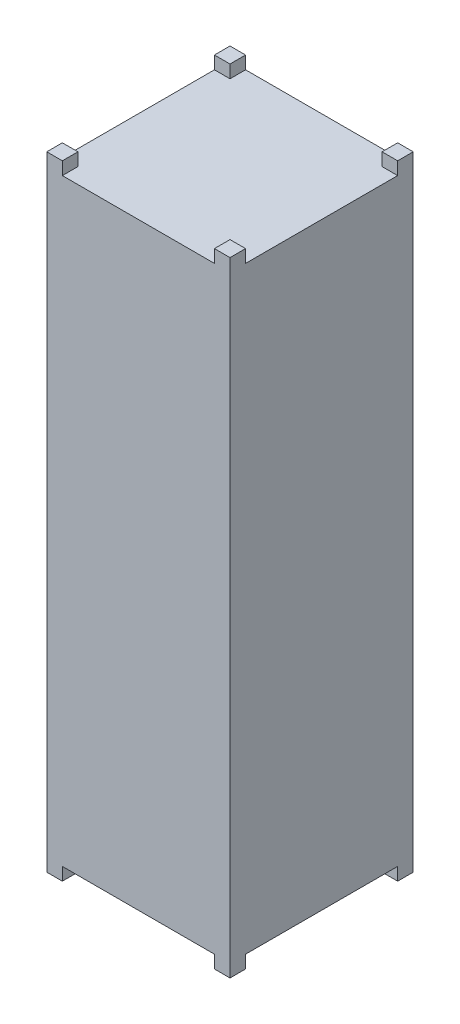
ISO-10303-21;
HEADER;
FILE_DESCRIPTION(('STEP AP214'),'2;1');
FILE_NAME('part.step','',(''),(''),'','','');
FILE_SCHEMA(('AUTOMOTIVE_DESIGN { 1 0 10303 214 1 1 1 1 }'));
ENDSEC;
DATA;
#1=APPLICATION_CONTEXT('core data for automotive mechanical design processes');
#2=APPLICATION_PROTOCOL_DEFINITION('international standard','automotive_design',2000,#1);
#3=PRODUCT_CONTEXT('',#1,'mechanical');
#4=PRODUCT('Part','Part','',(#3));
#5=PRODUCT_RELATED_PRODUCT_CATEGORY('part','',(#4));
#6=PRODUCT_DEFINITION_FORMATION('','',#4);
#7=PRODUCT_DEFINITION_CONTEXT('part definition',#1,'design');
#8=PRODUCT_DEFINITION('design','',#6,#7);
#9=PRODUCT_DEFINITION_SHAPE('','',#8);
#10=(LENGTH_UNIT() NAMED_UNIT(*) SI_UNIT(.MILLI.,.METRE.));
#11=(NAMED_UNIT(*) PLANE_ANGLE_UNIT() SI_UNIT($,.RADIAN.));
#12=(NAMED_UNIT(*) SI_UNIT($,.STERADIAN.) SOLID_ANGLE_UNIT());
#13=UNCERTAINTY_MEASURE_WITH_UNIT(LENGTH_MEASURE(1.E-05),#10,'distance_accuracy_value','');
#14=(GEOMETRIC_REPRESENTATION_CONTEXT(3) GLOBAL_UNCERTAINTY_ASSIGNED_CONTEXT((#13)) GLOBAL_UNIT_ASSIGNED_CONTEXT((#10,
#11,#12)) REPRESENTATION_CONTEXT('',''));
#15=CARTESIAN_POINT('',(0.,0.,0.));
#16=DIRECTION('',(0.,0.,1.));
#17=DIRECTION('',(1.,0.,0.));
#18=AXIS2_PLACEMENT_3D('',#15,#16,#17);
#19=CARTESIAN_POINT('',(-50.,333.5,0.));
#20=DIRECTION('',(-1.,0.,0.));
#21=DIRECTION('',(0.,0.,1.));
#22=AXIS2_PLACEMENT_3D('',#19,#20,#21);
#23=PLANE('',#22);
#24=DIRECTION('',(0.,0.,-1.));
#25=VECTOR('',#24,1.);
#26=CARTESIAN_POINT('',(-50.,7.,0.));
#27=LINE('',#26,#25);
#28=CARTESIAN_POINT('',(-50.0000000000006,7.00000000000001,41.5000000000003));
#29=VERTEX_POINT('',#28);
#30=CARTESIAN_POINT('',(-50.0000000000003,7.00000000000001,-41.5000000000002));
#31=VERTEX_POINT('',#30);
#32=EDGE_CURVE('E259',#29,#31,#27,.T.);
#33=ORIENTED_EDGE('',*,*,#32,.F.);
#34=DIRECTION('',(0.,-1.,0.));
#35=VECTOR('',#34,1.);
#36=CARTESIAN_POINT('',(-50.0000000000006,340.5,41.5000000000003));
#37=LINE('',#36,#35);
#38=CARTESIAN_POINT('',(-50.0000000000006,0.,41.5000000000003));
#39=VERTEX_POINT('',#38);
#40=EDGE_CURVE('E255',#29,#39,#37,.T.);
#41=ORIENTED_EDGE('',*,*,#40,.T.);
#42=DIRECTION('',(0.,0.,-1.00000000000003));
#43=VECTOR('',#42,1.);
#44=CARTESIAN_POINT('',(-50.,0.,0.));
#45=LINE('',#44,#43);
#46=CARTESIAN_POINT('',(-49.9999999999997,0.,50.0000000000014));
#47=VERTEX_POINT('',#46);
#48=EDGE_CURVE('E237',#47,#39,#45,.T.);
#49=ORIENTED_EDGE('',*,*,#48,.F.);
#50=DIRECTION('',(0.,-1.,0.));
#51=VECTOR('',#50,1.);
#52=CARTESIAN_POINT('',(-49.9999999999997,340.5,50.0000000000014));
#53=LINE('',#52,#51);
#54=CARTESIAN_POINT('',(-49.9999999999997,340.5,50.0000000000014));
#55=VERTEX_POINT('',#54);
#56=EDGE_CURVE('E252',#55,#47,#53,.T.);
#57=ORIENTED_EDGE('',*,*,#56,.F.);
#58=DIRECTION('',(0.,0.,-1.00000000000003));
#59=VECTOR('',#58,1.);
#60=CARTESIAN_POINT('',(-50.,340.5,0.));
#61=LINE('',#60,#59);
#62=CARTESIAN_POINT('',(-50.0000000000006,340.5,41.5000000000003));
#63=VERTEX_POINT('',#62);
#64=EDGE_CURVE('E224',#55,#63,#61,.T.);
#65=ORIENTED_EDGE('',*,*,#64,.T.);
#66=CARTESIAN_POINT('',(-50.0000000000006,333.5,41.5000000000003));
#67=VERTEX_POINT('',#66);
#68=EDGE_CURVE('E256',#63,#67,#37,.T.);
#69=ORIENTED_EDGE('',*,*,#68,.T.);
#70=DIRECTION('',(0.,0.,-1.));
#71=VECTOR('',#70,1.);
#72=CARTESIAN_POINT('',(-50.,333.5,0.));
#73=LINE('',#72,#71);
#74=CARTESIAN_POINT('',(-50.0000000000003,333.5,-41.5000000000002));
#75=VERTEX_POINT('',#74);
#76=EDGE_CURVE('E260',#67,#75,#73,.T.);
#77=ORIENTED_EDGE('',*,*,#76,.T.);
#78=DIRECTION('',(0.,-1.,0.));
#79=VECTOR('',#78,1.);
#80=CARTESIAN_POINT('',(-50.0000000000003,340.5,-41.5000000000002));
#81=LINE('',#80,#79);
#82=CARTESIAN_POINT('',(-50.0000000000003,340.5,-41.5000000000002));
#83=VERTEX_POINT('',#82);
#84=EDGE_CURVE('E210',#83,#75,#81,.T.);
#85=ORIENTED_EDGE('',*,*,#84,.F.);
#86=DIRECTION('',(0.,0.,-1.00000000000004));
#87=VECTOR('',#86,1.);
#88=CARTESIAN_POINT('',(-50.,340.5,0.));
#89=LINE('',#88,#87);
#90=CARTESIAN_POINT('',(-50.0000000000011,340.5,-50.0000000000011));
#91=VERTEX_POINT('',#90);
#92=EDGE_CURVE('E191',#83,#91,#89,.T.);
#93=ORIENTED_EDGE('',*,*,#92,.T.);
#94=DIRECTION('',(0.,-1.,0.));
#95=VECTOR('',#94,1.);
#96=CARTESIAN_POINT('',(-50.0000000000011,340.5,-50.0000000000011));
#97=LINE('',#96,#95);
#98=CARTESIAN_POINT('',(-50.0000000000011,0.,-50.0000000000011));
#99=VERTEX_POINT('',#98);
#100=EDGE_CURVE('E213',#91,#99,#97,.T.);
#101=ORIENTED_EDGE('',*,*,#100,.T.);
#102=DIRECTION('',(0.,0.,-1.00000000000004));
#103=VECTOR('',#102,1.);
#104=CARTESIAN_POINT('',(-50.,0.,0.));
#105=LINE('',#104,#103);
#106=CARTESIAN_POINT('',(-50.0000000000003,0.,-41.5000000000002));
#107=VERTEX_POINT('',#106);
#108=EDGE_CURVE('E202',#107,#99,#105,.T.);
#109=ORIENTED_EDGE('',*,*,#108,.F.);
#110=EDGE_CURVE('E209',#31,#107,#81,.T.);
#111=ORIENTED_EDGE('',*,*,#110,.F.);
#112=EDGE_LOOP('',(#33,#41,#49,#57,#65,#69,#77,#85,#93,#101,#109,#111));
#113=FACE_BOUND('',#112,.T.);
#114=ADVANCED_FACE('F35',(#113),#23,.T.);
#115=CARTESIAN_POINT('',(0.,333.5,50.));
#116=DIRECTION('',(0.,0.,-1.));
#117=DIRECTION('',(-1.,0.,0.));
#118=AXIS2_PLACEMENT_3D('',#115,#116,#117);
#119=PLANE('',#118);
#120=DIRECTION('',(1.,0.,0.));
#121=VECTOR('',#120,1.);
#122=CARTESIAN_POINT('',(0.,7.,50.));
#123=LINE('',#122,#121);
#124=CARTESIAN_POINT('',(-41.4999999999997,7.00000000000001,50.0000000000018));
#125=VERTEX_POINT('',#124);
#126=CARTESIAN_POINT('',(41.4999999999999,7.,50.));
#127=VERTEX_POINT('',#126);
#128=EDGE_CURVE('E286',#125,#127,#123,.T.);
#129=ORIENTED_EDGE('',*,*,#128,.T.);
#130=DIRECTION('',(0.,-1.,0.));
#131=VECTOR('',#130,1.);
#132=CARTESIAN_POINT('',(41.5000000000016,340.5,50.0000000000028));
#133=LINE('',#132,#131);
#134=CARTESIAN_POINT('',(41.5000000000016,0.,50.0000000000028));
#135=VERTEX_POINT('',#134);
#136=EDGE_CURVE('E172',#127,#135,#133,.T.);
#137=ORIENTED_EDGE('',*,*,#136,.T.);
#138=DIRECTION('',(1.00000000000006,0.,0.));
#139=VECTOR('',#138,1.);
#140=CARTESIAN_POINT('',(5.27355936696949E-13,0.,50.0000000000018));
#141=LINE('',#140,#139);
#142=CARTESIAN_POINT('',(50.0000000000024,0.,50.0000000000032));
#143=VERTEX_POINT('',#142);
#144=EDGE_CURVE('E150',#135,#143,#141,.T.);
#145=ORIENTED_EDGE('',*,*,#144,.T.);
#146=DIRECTION('',(0.,-1.,0.));
#147=VECTOR('',#146,1.);
#148=CARTESIAN_POINT('',(50.0000000000024,340.5,50.0000000000032));
#149=LINE('',#148,#147);
#150=CARTESIAN_POINT('',(50.0000000000024,340.5,50.0000000000032));
#151=VERTEX_POINT('',#150);
#152=EDGE_CURVE('E159',#151,#143,#149,.T.);
#153=ORIENTED_EDGE('',*,*,#152,.F.);
#154=DIRECTION('',(1.00000000000006,0.,0.));
#155=VECTOR('',#154,1.);
#156=CARTESIAN_POINT('',(5.27355936696949E-13,340.5,50.0000000000018));
#157=LINE('',#156,#155);
#158=CARTESIAN_POINT('',(41.5000000000016,340.5,50.0000000000028));
#159=VERTEX_POINT('',#158);
#160=EDGE_CURVE('E156',#159,#151,#157,.T.);
#161=ORIENTED_EDGE('',*,*,#160,.F.);
#162=CARTESIAN_POINT('',(41.4999999999999,333.5,50.));
#163=VERTEX_POINT('',#162);
#164=EDGE_CURVE('E173',#159,#163,#133,.T.);
#165=ORIENTED_EDGE('',*,*,#164,.T.);
#166=DIRECTION('',(1.,0.,0.));
#167=VECTOR('',#166,1.);
#168=CARTESIAN_POINT('',(0.,333.5,50.));
#169=LINE('',#168,#167);
#170=CARTESIAN_POINT('',(-41.4999999999997,333.5,50.0000000000018));
#171=VERTEX_POINT('',#170);
#172=EDGE_CURVE('E93',#171,#163,#169,.T.);
#173=ORIENTED_EDGE('',*,*,#172,.F.);
#174=DIRECTION('',(0.,-1.,0.));
#175=VECTOR('',#174,1.);
#176=CARTESIAN_POINT('',(-41.4999999999997,340.5,50.0000000000018));
#177=LINE('',#176,#175);
#178=CARTESIAN_POINT('',(-41.4999999999997,340.5,50.0000000000018));
#179=VERTEX_POINT('',#178);
#180=EDGE_CURVE('E249',#179,#171,#177,.T.);
#181=ORIENTED_EDGE('',*,*,#180,.F.);
#182=DIRECTION('',(1.00000000000003,0.,0.));
#183=VECTOR('',#182,1.);
#184=CARTESIAN_POINT('',(3.05311331771918E-13,340.5,50.000000000001));
#185=LINE('',#184,#183);
#186=EDGE_CURVE('E228',#55,#179,#185,.T.);
#187=ORIENTED_EDGE('',*,*,#186,.F.);
#188=ORIENTED_EDGE('',*,*,#56,.T.);
#189=DIRECTION('',(1.00000000000003,0.,0.));
#190=VECTOR('',#189,1.);
#191=CARTESIAN_POINT('',(3.05311331771918E-13,0.,50.000000000001));
#192=LINE('',#191,#190);
#193=CARTESIAN_POINT('',(-41.4999999999997,0.,50.0000000000018));
#194=VERTEX_POINT('',#193);
#195=EDGE_CURVE('E240',#47,#194,#192,.T.);
#196=ORIENTED_EDGE('',*,*,#195,.T.);
#197=EDGE_CURVE('E248',#125,#194,#177,.T.);
#198=ORIENTED_EDGE('',*,*,#197,.F.);
#199=EDGE_LOOP('',(#129,#137,#145,#153,#161,#165,#173,#181,#187,#188,#196,#198));
#200=FACE_BOUND('',#199,.T.);
#201=ADVANCED_FACE('F384',(#200),#119,.F.);
#202=CARTESIAN_POINT('',(50.,333.5,0.));
#203=DIRECTION('',(-1.,0.,0.));
#204=DIRECTION('',(0.,0.,1.));
#205=AXIS2_PLACEMENT_3D('',#202,#203,#204);
#206=PLANE('',#205);
#207=DIRECTION('',(0.,0.,-1.));
#208=VECTOR('',#207,1.);
#209=CARTESIAN_POINT('',(50.,7.,0.));
#210=LINE('',#209,#208);
#211=CARTESIAN_POINT('',(50.,7.,41.5000000000002));
#212=VERTEX_POINT('',#211);
#213=CARTESIAN_POINT('',(50.,7.,-41.5000000000001));
#214=VERTEX_POINT('',#213);
#215=EDGE_CURVE('E294',#212,#214,#210,.T.);
#216=ORIENTED_EDGE('',*,*,#215,.T.);
#217=DIRECTION('',(0.,-1.,0.));
#218=VECTOR('',#217,1.);
#219=CARTESIAN_POINT('',(50.0000000000036,340.5,-41.5000000000026));
#220=LINE('',#219,#218);
#221=CARTESIAN_POINT('',(50.0000000000036,0.,-41.5000000000026));
#222=VERTEX_POINT('',#221);
#223=EDGE_CURVE('E132',#214,#222,#220,.T.);
#224=ORIENTED_EDGE('',*,*,#223,.T.);
#225=DIRECTION('',(0.,0.,-1.00000000000006));
#226=VECTOR('',#225,1.);
#227=CARTESIAN_POINT('',(50.0000000000003,0.,0.));
#228=LINE('',#227,#226);
#229=CARTESIAN_POINT('',(50.,0.,-50.0000000000001));
#230=VERTEX_POINT('',#229);
#231=EDGE_CURVE('E473',#222,#230,#228,.T.);
#232=ORIENTED_EDGE('',*,*,#231,.T.);
#233=DIRECTION('',(0.,-1.,0.));
#234=VECTOR('',#233,1.);
#235=CARTESIAN_POINT('',(50.,340.5,-50.0000000000001));
#236=LINE('',#235,#234);
#237=CARTESIAN_POINT('',(50.,340.5,-50.0000000000001));
#238=VERTEX_POINT('',#237);
#239=EDGE_CURVE('E137',#238,#230,#236,.T.);
#240=ORIENTED_EDGE('',*,*,#239,.F.);
#241=DIRECTION('',(0.,0.,-1.00000000000006));
#242=VECTOR('',#241,1.);
#243=CARTESIAN_POINT('',(50.0000000000003,340.5,0.));
#244=LINE('',#243,#242);
#245=CARTESIAN_POINT('',(50.0000000000036,340.5,-41.5000000000026));
#246=VERTEX_POINT('',#245);
#247=EDGE_CURVE('E129',#246,#238,#244,.T.);
#248=ORIENTED_EDGE('',*,*,#247,.F.);
#249=CARTESIAN_POINT('',(50.,333.5,-41.5000000000001));
#250=VERTEX_POINT('',#249);
#251=EDGE_CURVE('E121',#246,#250,#220,.T.);
#252=ORIENTED_EDGE('',*,*,#251,.T.);
#253=DIRECTION('',(0.,0.,-1.));
#254=VECTOR('',#253,1.);
#255=CARTESIAN_POINT('',(50.,333.5,0.));
#256=LINE('',#255,#254);
#257=CARTESIAN_POINT('',(50.,333.5,41.5000000000002));
#258=VERTEX_POINT('',#257);
#259=EDGE_CURVE('E103',#258,#250,#256,.T.);
#260=ORIENTED_EDGE('',*,*,#259,.F.);
#261=DIRECTION('',(0.,-1.,0.));
#262=VECTOR('',#261,1.);
#263=CARTESIAN_POINT('',(50.0000000000026,340.5,41.5000000000027));
#264=LINE('',#263,#262);
#265=CARTESIAN_POINT('',(50.0000000000026,340.5,41.5000000000027));
#266=VERTEX_POINT('',#265);
#267=EDGE_CURVE('E181',#266,#258,#264,.T.);
#268=ORIENTED_EDGE('',*,*,#267,.F.);
#269=DIRECTION('',(0.,0.,-1.00000000000006));
#270=VECTOR('',#269,1.);
#271=CARTESIAN_POINT('',(50.0000000000003,340.5,0.));
#272=LINE('',#271,#270);
#273=EDGE_CURVE('E146',#151,#266,#272,.T.);
#274=ORIENTED_EDGE('',*,*,#273,.F.);
#275=ORIENTED_EDGE('',*,*,#152,.T.);
#276=DIRECTION('',(0.,0.,-1.00000000000006));
#277=VECTOR('',#276,1.);
#278=CARTESIAN_POINT('',(50.0000000000003,0.,0.));
#279=LINE('',#278,#277);
#280=CARTESIAN_POINT('',(50.0000000000026,0.,41.5000000000027));
#281=VERTEX_POINT('',#280);
#282=EDGE_CURVE('E145',#143,#281,#279,.T.);
#283=ORIENTED_EDGE('',*,*,#282,.T.);
#284=EDGE_CURVE('E180',#212,#281,#264,.T.);
#285=ORIENTED_EDGE('',*,*,#284,.F.);
#286=EDGE_LOOP('',(#216,#224,#232,#240,#248,#252,#260,#268,#274,#275,#283,#285));
#287=FACE_BOUND('',#286,.T.);
#288=ADVANCED_FACE('F126',(#287),#206,.F.);
#289=CARTESIAN_POINT('',(0.,333.5,-50.0000000000001));
#290=DIRECTION('',(0.,0.,-1.));
#291=DIRECTION('',(-1.,0.,0.));
#292=AXIS2_PLACEMENT_3D('',#289,#290,#291);
#293=PLANE('',#292);
#294=DIRECTION('',(1.,0.,0.));
#295=VECTOR('',#294,1.);
#296=CARTESIAN_POINT('',(0.,7.,-50.0000000000001));
#297=LINE('',#296,#295);
#298=CARTESIAN_POINT('',(-41.5000000000016,7.00000000000001,-50.0000000000023));
#299=VERTEX_POINT('',#298);
#300=CARTESIAN_POINT('',(41.5,7.,-50.0000000000001));
#301=VERTEX_POINT('',#300);
#302=EDGE_CURVE('E77',#299,#301,#297,.T.);
#303=ORIENTED_EDGE('',*,*,#302,.F.);
#304=DIRECTION('',(0.,-1.,0.));
#305=VECTOR('',#304,1.);
#306=CARTESIAN_POINT('',(-41.5000000000016,340.5,-50.0000000000023));
#307=LINE('',#306,#305);
#308=CARTESIAN_POINT('',(-41.5000000000016,0.,-50.0000000000023));
#309=VERTEX_POINT('',#308);
#310=EDGE_CURVE('E216',#299,#309,#307,.T.);
#311=ORIENTED_EDGE('',*,*,#310,.T.);
#312=DIRECTION('',(1.00000000000004,0.,0.));
#313=VECTOR('',#312,1.);
#314=CARTESIAN_POINT('',(0.,0.,-50.0000000000001));
#315=LINE('',#314,#313);
#316=EDGE_CURVE('E199',#99,#309,#315,.T.);
#317=ORIENTED_EDGE('',*,*,#316,.F.);
#318=ORIENTED_EDGE('',*,*,#100,.F.);
#319=DIRECTION('',(1.00000000000004,0.,0.));
#320=VECTOR('',#319,1.);
#321=CARTESIAN_POINT('',(0.,340.5,-50.0000000000001));
#322=LINE('',#321,#320);
#323=CARTESIAN_POINT('',(-41.5000000000016,340.5,-50.0000000000023));
#324=VERTEX_POINT('',#323);
#325=EDGE_CURVE('E187',#91,#324,#322,.T.);
#326=ORIENTED_EDGE('',*,*,#325,.T.);
#327=CARTESIAN_POINT('',(-41.5000000000016,333.5,-50.0000000000023));
#328=VERTEX_POINT('',#327);
#329=EDGE_CURVE('E217',#324,#328,#307,.T.);
#330=ORIENTED_EDGE('',*,*,#329,.T.);
#331=DIRECTION('',(1.,0.,0.));
#332=VECTOR('',#331,1.);
#333=CARTESIAN_POINT('',(0.,333.5,-50.0000000000001));
#334=LINE('',#333,#332);
#335=CARTESIAN_POINT('',(41.5,333.5,-50.0000000000001));
#336=VERTEX_POINT('',#335);
#337=EDGE_CURVE('E274',#328,#336,#334,.T.);
#338=ORIENTED_EDGE('',*,*,#337,.T.);
#339=DIRECTION('',(0.,-1.,0.));
#340=VECTOR('',#339,1.);
#341=CARTESIAN_POINT('',(41.5000000000001,340.5,-50.0000000000003));
#342=LINE('',#341,#340);
#343=CARTESIAN_POINT('',(41.5000000000001,340.5,-50.0000000000003));
#344=VERTEX_POINT('',#343);
#345=EDGE_CURVE('E142',#344,#336,#342,.T.);
#346=ORIENTED_EDGE('',*,*,#345,.F.);
#347=DIRECTION('',(1.00000000000006,0.,0.));
#348=VECTOR('',#347,1.);
#349=CARTESIAN_POINT('',(0.,340.5,-50.0000000000001));
#350=LINE('',#349,#348);
#351=EDGE_CURVE('E465',#344,#238,#350,.T.);
#352=ORIENTED_EDGE('',*,*,#351,.T.);
#353=ORIENTED_EDGE('',*,*,#239,.T.);
#354=DIRECTION('',(1.00000000000006,0.,0.));
#355=VECTOR('',#354,1.);
#356=CARTESIAN_POINT('',(0.,0.,-50.0000000000001));
#357=LINE('',#356,#355);
#358=CARTESIAN_POINT('',(41.5000000000001,0.,-50.0000000000003));
#359=VERTEX_POINT('',#358);
#360=EDGE_CURVE('E480',#359,#230,#357,.T.);
#361=ORIENTED_EDGE('',*,*,#360,.F.);
#362=EDGE_CURVE('E141',#301,#359,#342,.T.);
#363=ORIENTED_EDGE('',*,*,#362,.F.);
#364=EDGE_LOOP('',(#303,#311,#317,#318,#326,#330,#338,#346,#352,#353,#361,#363));
#365=FACE_BOUND('',#364,.T.);
#366=ADVANCED_FACE('F417',(#365),#293,.T.);
#367=CARTESIAN_POINT('',(0.,333.5,0.));
#368=DIRECTION('',(0.,1.,0.));
#369=DIRECTION('',(0.,0.,1.));
#370=AXIS2_PLACEMENT_3D('',#367,#368,#369);
#371=PLANE('',#370);
#372=ORIENTED_EDGE('',*,*,#76,.F.);
#373=DIRECTION('',(1.,0.,0.));
#374=VECTOR('',#373,1.);
#375=CARTESIAN_POINT('',(0.,333.5,41.5000000000001));
#376=LINE('',#375,#374);
#377=CARTESIAN_POINT('',(-41.5000000000006,333.5,41.5000000000009));
#378=VERTEX_POINT('',#377);
#379=EDGE_CURVE('E263',#67,#378,#376,.T.);
#380=ORIENTED_EDGE('',*,*,#379,.T.);
#381=DIRECTION('',(0.,0.,-1.));
#382=VECTOR('',#381,1.);
#383=CARTESIAN_POINT('',(-41.5,333.5,0.));
#384=LINE('',#383,#382);
#385=EDGE_CURVE('E266',#171,#378,#384,.T.);
#386=ORIENTED_EDGE('',*,*,#385,.F.);
#387=ORIENTED_EDGE('',*,*,#172,.T.);
#388=DIRECTION('',(0.,0.,-1.));
#389=VECTOR('',#388,1.);
#390=CARTESIAN_POINT('',(41.5,333.5,0.));
#391=LINE('',#390,#389);
#392=CARTESIAN_POINT('',(41.4999999999999,333.5,41.5000000000002));
#393=VERTEX_POINT('',#392);
#394=EDGE_CURVE('E270',#163,#393,#391,.T.);
#395=ORIENTED_EDGE('',*,*,#394,.T.);
#396=DIRECTION('',(-1.,0.,0.));
#397=VECTOR('',#396,1.);
#398=CARTESIAN_POINT('',(0.,333.5,41.5000000000001));
#399=LINE('',#398,#397);
#400=EDGE_CURVE('E109',#258,#393,#399,.T.);
#401=ORIENTED_EDGE('',*,*,#400,.F.);
#402=ORIENTED_EDGE('',*,*,#259,.T.);
#403=DIRECTION('',(-1.,0.,0.));
#404=VECTOR('',#403,1.);
#405=CARTESIAN_POINT('',(0.,333.5,-41.5000000000001));
#406=LINE('',#405,#404);
#407=CARTESIAN_POINT('',(41.5,333.5,-41.5000000000001));
#408=VERTEX_POINT('',#407);
#409=EDGE_CURVE('E107',#250,#408,#406,.T.);
#410=ORIENTED_EDGE('',*,*,#409,.T.);
#411=DIRECTION('',(0.,0.,1.));
#412=VECTOR('',#411,1.);
#413=CARTESIAN_POINT('',(41.5,333.5,0.));
#414=LINE('',#413,#412);
#415=EDGE_CURVE('E53',#336,#408,#414,.T.);
#416=ORIENTED_EDGE('',*,*,#415,.F.);
#417=ORIENTED_EDGE('',*,*,#337,.F.);
#418=DIRECTION('',(0.,0.,1.));
#419=VECTOR('',#418,1.);
#420=CARTESIAN_POINT('',(-41.5,333.5,0.));
#421=LINE('',#420,#419);
#422=CARTESIAN_POINT('',(-41.5000000000004,333.5,-41.5000000000003));
#423=VERTEX_POINT('',#422);
#424=EDGE_CURVE('E44',#328,#423,#421,.T.);
#425=ORIENTED_EDGE('',*,*,#424,.T.);
#426=DIRECTION('',(1.,0.,0.));
#427=VECTOR('',#426,1.);
#428=CARTESIAN_POINT('',(0.,333.5,-41.5000000000001));
#429=LINE('',#428,#427);
#430=EDGE_CURVE('E11',#75,#423,#429,.T.);
#431=ORIENTED_EDGE('',*,*,#430,.F.);
#432=EDGE_LOOP('',(#372,#380,#386,#387,#395,#401,#402,#410,#416,#417,#425,#431));
#433=FACE_BOUND('',#432,.T.);
#434=ADVANCED_FACE('F106',(#433),#371,.T.);
#435=CARTESIAN_POINT('',(0.,7.,0.));
#436=DIRECTION('',(0.,1.,0.));
#437=DIRECTION('',(0.,0.,1.));
#438=AXIS2_PLACEMENT_3D('',#435,#436,#437);
#439=PLANE('',#438);
#440=ORIENTED_EDGE('',*,*,#32,.T.);
#441=DIRECTION('',(1.,0.,0.));
#442=VECTOR('',#441,1.);
#443=CARTESIAN_POINT('',(0.,7.,-41.5000000000001));
#444=LINE('',#443,#442);
#445=CARTESIAN_POINT('',(-41.5,7.,-41.5000000000001));
#446=VERTEX_POINT('',#445);
#447=EDGE_CURVE('E38',#31,#446,#444,.T.);
#448=ORIENTED_EDGE('',*,*,#447,.T.);
#449=DIRECTION('',(0.,0.,1.));
#450=VECTOR('',#449,1.);
#451=CARTESIAN_POINT('',(-41.5,7.,0.));
#452=LINE('',#451,#450);
#453=EDGE_CURVE('E301',#299,#446,#452,.T.);
#454=ORIENTED_EDGE('',*,*,#453,.F.);
#455=ORIENTED_EDGE('',*,*,#302,.T.);
#456=DIRECTION('',(0.,0.,1.));
#457=VECTOR('',#456,1.);
#458=CARTESIAN_POINT('',(41.5,7.,0.));
#459=LINE('',#458,#457);
#460=CARTESIAN_POINT('',(41.5000000000027,7.00000000000001,-41.5000000000026));
#461=VERTEX_POINT('',#460);
#462=EDGE_CURVE('E299',#301,#461,#459,.T.);
#463=ORIENTED_EDGE('',*,*,#462,.T.);
#464=DIRECTION('',(-1.,0.,0.));
#465=VECTOR('',#464,1.);
#466=CARTESIAN_POINT('',(0.,7.,-41.5000000000001));
#467=LINE('',#466,#465);
#468=EDGE_CURVE('E296',#214,#461,#467,.T.);
#469=ORIENTED_EDGE('',*,*,#468,.F.);
#470=ORIENTED_EDGE('',*,*,#215,.F.);
#471=DIRECTION('',(-1.,0.,0.));
#472=VECTOR('',#471,1.);
#473=CARTESIAN_POINT('',(0.,7.,41.5000000000001));
#474=LINE('',#473,#472);
#475=CARTESIAN_POINT('',(41.5000000000012,7.00000000000001,41.5000000000034));
#476=VERTEX_POINT('',#475);
#477=EDGE_CURVE('E291',#212,#476,#474,.T.);
#478=ORIENTED_EDGE('',*,*,#477,.T.);
#479=DIRECTION('',(0.,0.,-1.));
#480=VECTOR('',#479,1.);
#481=CARTESIAN_POINT('',(41.5,7.,0.));
#482=LINE('',#481,#480);
#483=EDGE_CURVE('E288',#127,#476,#482,.T.);
#484=ORIENTED_EDGE('',*,*,#483,.F.);
#485=ORIENTED_EDGE('',*,*,#128,.F.);
#486=DIRECTION('',(0.,0.,-1.));
#487=VECTOR('',#486,1.);
#488=CARTESIAN_POINT('',(-41.5,7.,0.));
#489=LINE('',#488,#487);
#490=CARTESIAN_POINT('',(-41.5000000000001,7.,41.5));
#491=VERTEX_POINT('',#490);
#492=EDGE_CURVE('E283',#125,#491,#489,.T.);
#493=ORIENTED_EDGE('',*,*,#492,.T.);
#494=DIRECTION('',(1.,0.,0.));
#495=VECTOR('',#494,1.);
#496=CARTESIAN_POINT('',(0.,7.,41.5000000000001));
#497=LINE('',#496,#495);
#498=EDGE_CURVE('E280',#29,#491,#497,.T.);
#499=ORIENTED_EDGE('',*,*,#498,.F.);
#500=EDGE_LOOP('',(#440,#448,#454,#455,#463,#469,#470,#478,#484,#485,#493,#499));
#501=FACE_BOUND('',#500,.T.);
#502=ADVANCED_FACE('F305',(#501),#439,.F.);
#503=CARTESIAN_POINT('',(3.33066907387547E-13,340.5,41.5000000000014));
#504=DIRECTION('',(0.,0.,-1.));
#505=DIRECTION('',(-1.,0.,0.));
#506=AXIS2_PLACEMENT_3D('',#503,#504,#505);
#507=PLANE('',#506);
#508=ORIENTED_EDGE('',*,*,#498,.T.);
#509=DIRECTION('',(0.,-1.,0.));
#510=VECTOR('',#509,1.);
#511=CARTESIAN_POINT('',(-41.5000000000006,340.5,41.5000000000009));
#512=LINE('',#511,#510);
#513=CARTESIAN_POINT('',(-41.5000000000006,0.,41.5000000000009));
#514=VERTEX_POINT('',#513);
#515=EDGE_CURVE('E234',#491,#514,#512,.T.);
#516=ORIENTED_EDGE('',*,*,#515,.T.);
#517=DIRECTION('',(1.00000000000003,0.,0.));
#518=VECTOR('',#517,1.);
#519=CARTESIAN_POINT('',(3.33066907387547E-13,0.,41.5000000000014));
#520=LINE('',#519,#518);
#521=EDGE_CURVE('E220',#39,#514,#520,.T.);
#522=ORIENTED_EDGE('',*,*,#521,.F.);
#523=ORIENTED_EDGE('',*,*,#40,.F.);
#524=EDGE_LOOP('',(#508,#516,#522,#523));
#525=FACE_BOUND('',#524,.T.);
#526=ADVANCED_FACE('F376',(#525),#507,.T.);
#527=CARTESIAN_POINT('',(-41.5,340.5,0.));
#528=DIRECTION('',(-1.,0.,0.));
#529=DIRECTION('',(0.,0.,1.));
#530=AXIS2_PLACEMENT_3D('',#527,#528,#529);
#531=PLANE('',#530);
#532=ORIENTED_EDGE('',*,*,#515,.F.);
#533=ORIENTED_EDGE('',*,*,#492,.F.);
#534=ORIENTED_EDGE('',*,*,#197,.T.);
#535=DIRECTION('',(0.,0.,-1.00000000000003));
#536=VECTOR('',#535,1.);
#537=CARTESIAN_POINT('',(-41.5,0.,0.));
#538=LINE('',#537,#536);
#539=EDGE_CURVE('E225',#194,#514,#538,.T.);
#540=ORIENTED_EDGE('',*,*,#539,.T.);
#541=EDGE_LOOP('',(#532,#533,#534,#540));
#542=FACE_BOUND('',#541,.T.);
#543=ADVANCED_FACE('F382',(#542),#531,.F.);
#544=CARTESIAN_POINT('',(-41.5000000000006,340.5,41.5000000000009));
#545=VERTEX_POINT('',#544);
#546=EDGE_CURVE('E245',#545,#378,#512,.T.);
#547=ORIENTED_EDGE('',*,*,#546,.T.);
#548=ORIENTED_EDGE('',*,*,#379,.F.);
#549=ORIENTED_EDGE('',*,*,#68,.F.);
#550=DIRECTION('',(1.00000000000003,0.,0.));
#551=VECTOR('',#550,1.);
#552=CARTESIAN_POINT('',(3.33066907387547E-13,340.5,41.5000000000014));
#553=LINE('',#552,#551);
#554=EDGE_CURVE('E221',#63,#545,#553,.T.);
#555=ORIENTED_EDGE('',*,*,#554,.T.);
#556=EDGE_LOOP('',(#547,#548,#549,#555));
#557=FACE_BOUND('',#556,.T.);
#558=ADVANCED_FACE('F398',(#557),#507,.T.);
#559=ORIENTED_EDGE('',*,*,#385,.T.);
#560=ORIENTED_EDGE('',*,*,#546,.F.);
#561=DIRECTION('',(0.,0.,-1.00000000000003));
#562=VECTOR('',#561,1.);
#563=CARTESIAN_POINT('',(-41.5,340.5,0.));
#564=LINE('',#563,#562);
#565=EDGE_CURVE('E231',#179,#545,#564,.T.);
#566=ORIENTED_EDGE('',*,*,#565,.F.);
#567=ORIENTED_EDGE('',*,*,#180,.T.);
#568=EDGE_LOOP('',(#559,#560,#566,#567));
#569=FACE_BOUND('',#568,.T.);
#570=ADVANCED_FACE('F552',(#569),#531,.F.);
#571=CARTESIAN_POINT('',(0.,340.5,0.));
#572=DIRECTION('',(0.,1.,0.));
#573=DIRECTION('',(0.,0.,1.00000000000003));
#574=AXIS2_PLACEMENT_3D('',#571,#572,#573);
#575=PLANE('',#574);
#576=ORIENTED_EDGE('',*,*,#554,.F.);
#577=ORIENTED_EDGE('',*,*,#64,.F.);
#578=ORIENTED_EDGE('',*,*,#186,.T.);
#579=ORIENTED_EDGE('',*,*,#565,.T.);
#580=EDGE_LOOP('',(#576,#577,#578,#579));
#581=FACE_BOUND('',#580,.T.);
#582=ADVANCED_FACE('F396',(#581),#575,.T.);
#583=CARTESIAN_POINT('',(0.,0.,0.));
#584=DIRECTION('',(0.,1.,0.));
#585=DIRECTION('',(0.,0.,1.00000000000003));
#586=AXIS2_PLACEMENT_3D('',#583,#584,#585);
#587=PLANE('',#586);
#588=ORIENTED_EDGE('',*,*,#521,.T.);
#589=ORIENTED_EDGE('',*,*,#539,.F.);
#590=ORIENTED_EDGE('',*,*,#195,.F.);
#591=ORIENTED_EDGE('',*,*,#48,.T.);
#592=EDGE_LOOP('',(#588,#589,#590,#591));
#593=FACE_BOUND('',#592,.T.);
#594=ADVANCED_FACE('F390',(#593),#587,.F.);
#595=CARTESIAN_POINT('',(-41.5,340.5,0.));
#596=DIRECTION('',(1.,0.,0.));
#597=DIRECTION('',(0.,0.,-1.));
#598=AXIS2_PLACEMENT_3D('',#595,#596,#597);
#599=PLANE('',#598);
#600=ORIENTED_EDGE('',*,*,#453,.T.);
#601=DIRECTION('',(0.,-1.,0.));
#602=VECTOR('',#601,1.);
#603=CARTESIAN_POINT('',(-41.5000000000004,340.5,-41.5000000000003));
#604=LINE('',#603,#602);
#605=CARTESIAN_POINT('',(-41.5000000000004,0.,-41.5000000000003));
#606=VERTEX_POINT('',#605);
#607=EDGE_CURVE('E85',#446,#606,#604,.T.);
#608=ORIENTED_EDGE('',*,*,#607,.T.);
#609=DIRECTION('',(0.,0.,1.00000000000004));
#610=VECTOR('',#609,1.);
#611=CARTESIAN_POINT('',(-41.5,0.,0.));
#612=LINE('',#611,#610);
#613=EDGE_CURVE('E183',#309,#606,#612,.T.);
#614=ORIENTED_EDGE('',*,*,#613,.F.);
#615=ORIENTED_EDGE('',*,*,#310,.F.);
#616=EDGE_LOOP('',(#600,#608,#614,#615));
#617=FACE_BOUND('',#616,.T.);
#618=ADVANCED_FACE('F558',(#617),#599,.T.);
#619=CARTESIAN_POINT('',(0.,340.5,-41.5000000000002));
#620=DIRECTION('',(0.,0.,-1.));
#621=DIRECTION('',(-1.,0.,0.));
#622=AXIS2_PLACEMENT_3D('',#619,#620,#621);
#623=PLANE('',#622);
#624=ORIENTED_EDGE('',*,*,#607,.F.);
#625=ORIENTED_EDGE('',*,*,#447,.F.);
#626=ORIENTED_EDGE('',*,*,#110,.T.);
#627=DIRECTION('',(1.00000000000004,0.,0.));
#628=VECTOR('',#627,1.);
#629=CARTESIAN_POINT('',(0.,0.,-41.5000000000002));
#630=LINE('',#629,#628);
#631=EDGE_CURVE('E188',#107,#606,#630,.T.);
#632=ORIENTED_EDGE('',*,*,#631,.T.);
#633=EDGE_LOOP('',(#624,#625,#626,#632));
#634=FACE_BOUND('',#633,.T.);
#635=ADVANCED_FACE('F312',(#634),#623,.F.);
#636=CARTESIAN_POINT('',(-41.5000000000004,340.5,-41.5000000000003));
#637=VERTEX_POINT('',#636);
#638=EDGE_CURVE('E206',#637,#423,#604,.T.);
#639=ORIENTED_EDGE('',*,*,#638,.T.);
#640=ORIENTED_EDGE('',*,*,#424,.F.);
#641=ORIENTED_EDGE('',*,*,#329,.F.);
#642=DIRECTION('',(0.,0.,1.00000000000004));
#643=VECTOR('',#642,1.);
#644=CARTESIAN_POINT('',(-41.5,340.5,0.));
#645=LINE('',#644,#643);
#646=EDGE_CURVE('E184',#324,#637,#645,.T.);
#647=ORIENTED_EDGE('',*,*,#646,.T.);
#648=EDGE_LOOP('',(#639,#640,#641,#647));
#649=FACE_BOUND('',#648,.T.);
#650=ADVANCED_FACE('F406',(#649),#599,.T.);
#651=ORIENTED_EDGE('',*,*,#430,.T.);
#652=ORIENTED_EDGE('',*,*,#638,.F.);
#653=DIRECTION('',(1.00000000000004,0.,0.));
#654=VECTOR('',#653,1.);
#655=CARTESIAN_POINT('',(0.,340.5,-41.5000000000002));
#656=LINE('',#655,#654);
#657=EDGE_CURVE('E194',#83,#637,#656,.T.);
#658=ORIENTED_EDGE('',*,*,#657,.F.);
#659=ORIENTED_EDGE('',*,*,#84,.T.);
#660=EDGE_LOOP('',(#651,#652,#658,#659));
#661=FACE_BOUND('',#660,.T.);
#662=ADVANCED_FACE('F403',(#661),#623,.F.);
#663=CARTESIAN_POINT('',(0.,340.5,0.));
#664=DIRECTION('',(0.,1.,0.));
#665=DIRECTION('',(0.,0.,1.00000000000004));
#666=AXIS2_PLACEMENT_3D('',#663,#664,#665);
#667=PLANE('',#666);
#668=ORIENTED_EDGE('',*,*,#646,.F.);
#669=ORIENTED_EDGE('',*,*,#325,.F.);
#670=ORIENTED_EDGE('',*,*,#92,.F.);
#671=ORIENTED_EDGE('',*,*,#657,.T.);
#672=EDGE_LOOP('',(#668,#669,#670,#671));
#673=FACE_BOUND('',#672,.T.);
#674=ADVANCED_FACE('F412',(#673),#667,.T.);
#675=CARTESIAN_POINT('',(0.,0.,0.));
#676=DIRECTION('',(0.,1.,0.));
#677=DIRECTION('',(0.,0.,1.00000000000004));
#678=AXIS2_PLACEMENT_3D('',#675,#676,#677);
#679=PLANE('',#678);
#680=ORIENTED_EDGE('',*,*,#613,.T.);
#681=ORIENTED_EDGE('',*,*,#631,.F.);
#682=ORIENTED_EDGE('',*,*,#108,.T.);
#683=ORIENTED_EDGE('',*,*,#316,.T.);
#684=EDGE_LOOP('',(#680,#681,#682,#683));
#685=FACE_BOUND('',#684,.T.);
#686=ADVANCED_FACE('F327',(#685),#679,.F.);
#687=CARTESIAN_POINT('',(6.66133814775094E-13,340.5,41.5000000000024));
#688=DIRECTION('',(0.,0.,1.));
#689=DIRECTION('',(1.,0.,0.));
#690=AXIS2_PLACEMENT_3D('',#687,#688,#689);
#691=PLANE('',#690);
#692=DIRECTION('',(0.,-1.,0.));
#693=VECTOR('',#692,1.);
#694=CARTESIAN_POINT('',(41.5000000000012,340.5,41.5000000000034));
#695=LINE('',#694,#693);
#696=CARTESIAN_POINT('',(41.5000000000012,0.,41.5000000000034));
#697=VERTEX_POINT('',#696);
#698=EDGE_CURVE('E176',#476,#697,#695,.T.);
#699=ORIENTED_EDGE('',*,*,#698,.F.);
#700=ORIENTED_EDGE('',*,*,#477,.F.);
#701=ORIENTED_EDGE('',*,*,#284,.T.);
#702=DIRECTION('',(-1.00000000000006,0.,0.));
#703=VECTOR('',#702,1.);
#704=CARTESIAN_POINT('',(6.66133814775094E-13,0.,41.5000000000024));
#705=LINE('',#704,#703);
#706=EDGE_CURVE('E162',#281,#697,#705,.T.);
#707=ORIENTED_EDGE('',*,*,#706,.T.);
#708=EDGE_LOOP('',(#699,#700,#701,#707));
#709=FACE_BOUND('',#708,.T.);
#710=ADVANCED_FACE('F505',(#709),#691,.F.);
#711=CARTESIAN_POINT('',(41.5000000000004,340.5,0.));
#712=DIRECTION('',(-1.,0.,0.));
#713=DIRECTION('',(0.,0.,1.));
#714=AXIS2_PLACEMENT_3D('',#711,#712,#713);
#715=PLANE('',#714);
#716=ORIENTED_EDGE('',*,*,#483,.T.);
#717=ORIENTED_EDGE('',*,*,#698,.T.);
#718=DIRECTION('',(0.,0.,-1.00000000000006));
#719=VECTOR('',#718,1.);
#720=CARTESIAN_POINT('',(41.5000000000004,0.,0.));
#721=LINE('',#720,#719);
#722=EDGE_CURVE('E165',#135,#697,#721,.T.);
#723=ORIENTED_EDGE('',*,*,#722,.F.);
#724=ORIENTED_EDGE('',*,*,#136,.F.);
#725=EDGE_LOOP('',(#716,#717,#723,#724));
#726=FACE_BOUND('',#725,.T.);
#727=ADVANCED_FACE('F509',(#726),#715,.T.);
#728=ORIENTED_EDGE('',*,*,#400,.T.);
#729=CARTESIAN_POINT('',(41.5000000000012,340.5,41.5000000000034));
#730=VERTEX_POINT('',#729);
#731=EDGE_CURVE('E177',#730,#393,#695,.T.);
#732=ORIENTED_EDGE('',*,*,#731,.F.);
#733=DIRECTION('',(-1.00000000000006,0.,0.));
#734=VECTOR('',#733,1.);
#735=CARTESIAN_POINT('',(6.66133814775094E-13,340.5,41.5000000000024));
#736=LINE('',#735,#734);
#737=EDGE_CURVE('E149',#266,#730,#736,.T.);
#738=ORIENTED_EDGE('',*,*,#737,.F.);
#739=ORIENTED_EDGE('',*,*,#267,.T.);
#740=EDGE_LOOP('',(#728,#732,#738,#739));
#741=FACE_BOUND('',#740,.T.);
#742=ADVANCED_FACE('F525',(#741),#691,.F.);
#743=ORIENTED_EDGE('',*,*,#731,.T.);
#744=ORIENTED_EDGE('',*,*,#394,.F.);
#745=ORIENTED_EDGE('',*,*,#164,.F.);
#746=DIRECTION('',(0.,0.,-1.00000000000006));
#747=VECTOR('',#746,1.);
#748=CARTESIAN_POINT('',(41.5000000000004,340.5,0.));
#749=LINE('',#748,#747);
#750=EDGE_CURVE('E153',#159,#730,#749,.T.);
#751=ORIENTED_EDGE('',*,*,#750,.T.);
#752=EDGE_LOOP('',(#743,#744,#745,#751));
#753=FACE_BOUND('',#752,.T.);
#754=ADVANCED_FACE('F523',(#753),#715,.T.);
#755=CARTESIAN_POINT('',(0.,340.5,0.));
#756=DIRECTION('',(0.,1.,0.));
#757=DIRECTION('',(0.,0.,1.00000000000006));
#758=AXIS2_PLACEMENT_3D('',#755,#756,#757);
#759=PLANE('',#758);
#760=ORIENTED_EDGE('',*,*,#273,.T.);
#761=ORIENTED_EDGE('',*,*,#737,.T.);
#762=ORIENTED_EDGE('',*,*,#750,.F.);
#763=ORIENTED_EDGE('',*,*,#160,.T.);
#764=EDGE_LOOP('',(#760,#761,#762,#763));
#765=FACE_BOUND('',#764,.T.);
#766=ADVANCED_FACE('F520',(#765),#759,.T.);
#767=CARTESIAN_POINT('',(0.,0.,0.));
#768=DIRECTION('',(0.,1.,0.));
#769=DIRECTION('',(0.,0.,1.00000000000006));
#770=AXIS2_PLACEMENT_3D('',#767,#768,#769);
#771=PLANE('',#770);
#772=ORIENTED_EDGE('',*,*,#282,.F.);
#773=ORIENTED_EDGE('',*,*,#144,.F.);
#774=ORIENTED_EDGE('',*,*,#722,.T.);
#775=ORIENTED_EDGE('',*,*,#706,.F.);
#776=EDGE_LOOP('',(#772,#773,#774,#775));
#777=FACE_BOUND('',#776,.T.);
#778=ADVANCED_FACE('F515',(#777),#771,.F.);
#779=CARTESIAN_POINT('',(41.5000000000001,340.5,0.));
#780=DIRECTION('',(1.,0.,0.));
#781=DIRECTION('',(0.,0.,-1.));
#782=AXIS2_PLACEMENT_3D('',#779,#780,#781);
#783=PLANE('',#782);
#784=DIRECTION('',(0.,-1.,0.));
#785=VECTOR('',#784,1.);
#786=CARTESIAN_POINT('',(41.5000000000027,340.5,-41.5000000000026));
#787=LINE('',#786,#785);
#788=CARTESIAN_POINT('',(41.5000000000027,0.,-41.5000000000026));
#789=VERTEX_POINT('',#788);
#790=EDGE_CURVE('E131',#461,#789,#787,.T.);
#791=ORIENTED_EDGE('',*,*,#790,.F.);
#792=ORIENTED_EDGE('',*,*,#462,.F.);
#793=ORIENTED_EDGE('',*,*,#362,.T.);
#794=DIRECTION('',(0.,0.,1.00000000000006));
#795=VECTOR('',#794,1.);
#796=CARTESIAN_POINT('',(41.5000000000001,0.,0.));
#797=LINE('',#796,#795);
#798=EDGE_CURVE('E483',#359,#789,#797,.T.);
#799=ORIENTED_EDGE('',*,*,#798,.T.);
#800=EDGE_LOOP('',(#791,#792,#793,#799));
#801=FACE_BOUND('',#800,.T.);
#802=ADVANCED_FACE('F499',(#801),#783,.F.);
#803=CARTESIAN_POINT('',(1.11022302462516E-13,340.5,-41.5000000000002));
#804=DIRECTION('',(0.,0.,1.));
#805=DIRECTION('',(1.,0.,0.));
#806=AXIS2_PLACEMENT_3D('',#803,#804,#805);
#807=PLANE('',#806);
#808=ORIENTED_EDGE('',*,*,#468,.T.);
#809=ORIENTED_EDGE('',*,*,#790,.T.);
#810=DIRECTION('',(-1.00000000000006,0.,0.));
#811=VECTOR('',#810,1.);
#812=CARTESIAN_POINT('',(1.11022302462516E-13,0.,-41.5000000000002));
#813=LINE('',#812,#811);
#814=EDGE_CURVE('E476',#222,#789,#813,.T.);
#815=ORIENTED_EDGE('',*,*,#814,.F.);
#816=ORIENTED_EDGE('',*,*,#223,.F.);
#817=EDGE_LOOP('',(#808,#809,#815,#816));
#818=FACE_BOUND('',#817,.T.);
#819=ADVANCED_FACE('F495',(#818),#807,.T.);
#820=ORIENTED_EDGE('',*,*,#415,.T.);
#821=CARTESIAN_POINT('',(41.5000000000027,340.5,-41.5000000000026));
#822=VERTEX_POINT('',#821);
#823=EDGE_CURVE('E124',#822,#408,#787,.T.);
#824=ORIENTED_EDGE('',*,*,#823,.F.);
#825=DIRECTION('',(0.,0.,1.00000000000006));
#826=VECTOR('',#825,1.);
#827=CARTESIAN_POINT('',(41.5000000000001,340.5,0.));
#828=LINE('',#827,#826);
#829=EDGE_CURVE('E467',#344,#822,#828,.T.);
#830=ORIENTED_EDGE('',*,*,#829,.F.);
#831=ORIENTED_EDGE('',*,*,#345,.T.);
#832=EDGE_LOOP('',(#820,#824,#830,#831));
#833=FACE_BOUND('',#832,.T.);
#834=ADVANCED_FACE('F468',(#833),#783,.F.);
#835=ORIENTED_EDGE('',*,*,#823,.T.);
#836=ORIENTED_EDGE('',*,*,#409,.F.);
#837=ORIENTED_EDGE('',*,*,#251,.F.);
#838=DIRECTION('',(-1.00000000000006,0.,0.));
#839=VECTOR('',#838,1.);
#840=CARTESIAN_POINT('',(1.11022302462516E-13,340.5,-41.5000000000002));
#841=LINE('',#840,#839);
#842=EDGE_CURVE('E470',#246,#822,#841,.T.);
#843=ORIENTED_EDGE('',*,*,#842,.T.);
#844=EDGE_LOOP('',(#835,#836,#837,#843));
#845=FACE_BOUND('',#844,.T.);
#846=ADVANCED_FACE('F118',(#845),#807,.T.);
#847=CARTESIAN_POINT('',(0.,340.5,0.));
#848=DIRECTION('',(0.,1.,0.));
#849=DIRECTION('',(0.,0.,1.00000000000006));
#850=AXIS2_PLACEMENT_3D('',#847,#848,#849);
#851=PLANE('',#850);
#852=ORIENTED_EDGE('',*,*,#351,.F.);
#853=ORIENTED_EDGE('',*,*,#829,.T.);
#854=ORIENTED_EDGE('',*,*,#842,.F.);
#855=ORIENTED_EDGE('',*,*,#247,.T.);
#856=EDGE_LOOP('',(#852,#853,#854,#855));
#857=FACE_BOUND('',#856,.T.);
#858=ADVANCED_FACE('F472',(#857),#851,.T.);
#859=CARTESIAN_POINT('',(0.,0.,0.));
#860=DIRECTION('',(0.,1.,0.));
#861=DIRECTION('',(0.,0.,1.00000000000006));
#862=AXIS2_PLACEMENT_3D('',#859,#860,#861);
#863=PLANE('',#862);
#864=ORIENTED_EDGE('',*,*,#360,.T.);
#865=ORIENTED_EDGE('',*,*,#231,.F.);
#866=ORIENTED_EDGE('',*,*,#814,.T.);
#867=ORIENTED_EDGE('',*,*,#798,.F.);
#868=EDGE_LOOP('',(#864,#865,#866,#867));
#869=FACE_BOUND('',#868,.T.);
#870=ADVANCED_FACE('F491',(#869),#863,.F.);
#871=CLOSED_SHELL('',(#114,#201,#288,#366,#434,#502,#526,#543,#558,#570,#582,#594,#618,#635,
#650,#662,#674,#686,#710,#727,#742,#754,#766,#778,#802,#819,#834,#846,#858,#870));
#872=MANIFOLD_SOLID_BREP('B2',#871);
#873=ADVANCED_BREP_SHAPE_REPRESENTATION('',(#18,#872),#14);
#874=SHAPE_DEFINITION_REPRESENTATION(#9,#873);
ENDSEC;
END-ISO-10303-21;
